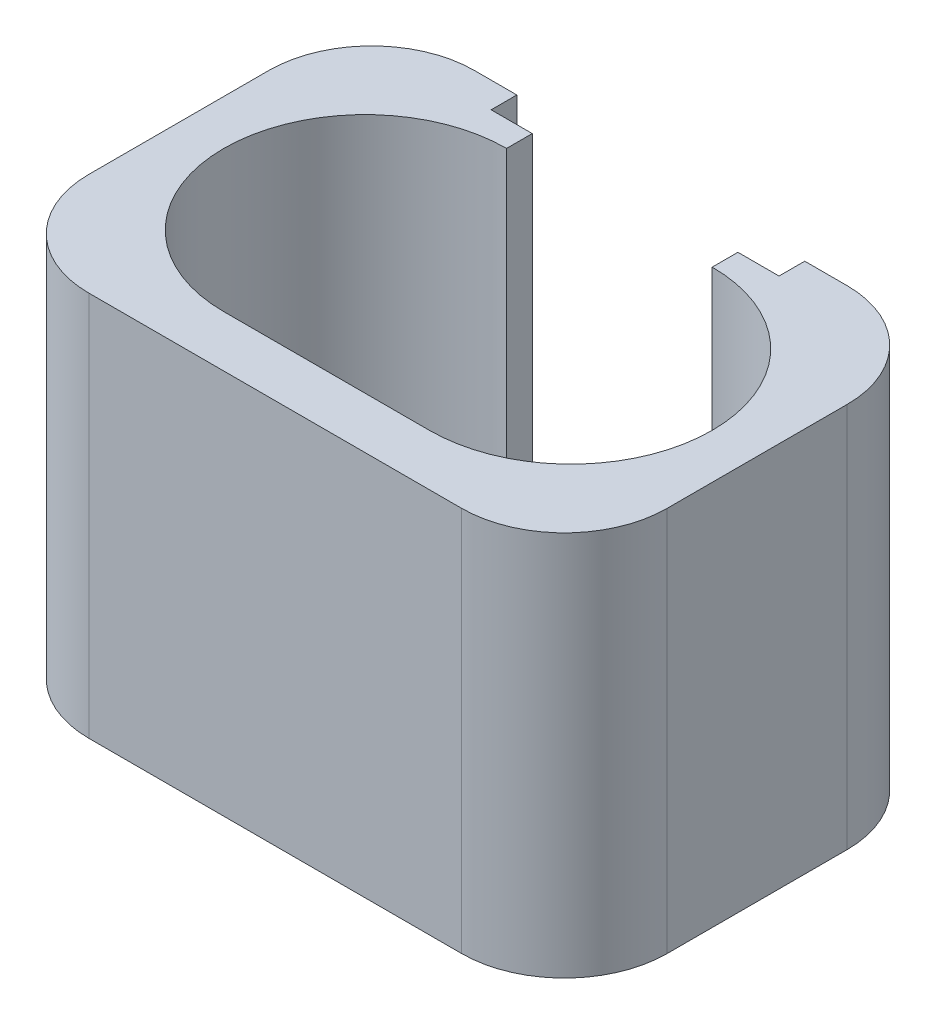
ISO-10303-21;
HEADER;
FILE_DESCRIPTION(('STEP AP214'),'2;1');
FILE_NAME('part.step','',(''),(''),'','','');
FILE_SCHEMA(('AUTOMOTIVE_DESIGN { 1 0 10303 214 1 1 1 1 }'));
ENDSEC;
DATA;
#1=APPLICATION_CONTEXT('core data for automotive mechanical design processes');
#2=APPLICATION_PROTOCOL_DEFINITION('international standard','automotive_design',2000,#1);
#3=PRODUCT_CONTEXT('',#1,'mechanical');
#4=PRODUCT('Part','Part','',(#3));
#5=PRODUCT_RELATED_PRODUCT_CATEGORY('part','',(#4));
#6=PRODUCT_DEFINITION_FORMATION('','',#4);
#7=PRODUCT_DEFINITION_CONTEXT('part definition',#1,'design');
#8=PRODUCT_DEFINITION('design','',#6,#7);
#9=PRODUCT_DEFINITION_SHAPE('','',#8);
#10=(LENGTH_UNIT() NAMED_UNIT(*) SI_UNIT(.MILLI.,.METRE.));
#11=(NAMED_UNIT(*) PLANE_ANGLE_UNIT() SI_UNIT($,.RADIAN.));
#12=(NAMED_UNIT(*) SI_UNIT($,.STERADIAN.) SOLID_ANGLE_UNIT());
#13=UNCERTAINTY_MEASURE_WITH_UNIT(LENGTH_MEASURE(1.E-05),#10,'distance_accuracy_value','');
#14=(GEOMETRIC_REPRESENTATION_CONTEXT(3) GLOBAL_UNCERTAINTY_ASSIGNED_CONTEXT((#13)) GLOBAL_UNIT_ASSIGNED_CONTEXT((#10,
#11,#12)) REPRESENTATION_CONTEXT('',''));
#15=CARTESIAN_POINT('',(0.,0.,0.));
#16=DIRECTION('',(0.,0.,1.));
#17=DIRECTION('',(1.,0.,0.));
#18=AXIS2_PLACEMENT_3D('',#15,#16,#17);
#19=CARTESIAN_POINT('',(-22.5,7.5,-15.));
#20=DIRECTION('',(0.,0.,1.));
#21=DIRECTION('',(1.,0.,0.));
#22=AXIS2_PLACEMENT_3D('',#19,#20,#21);
#23=PLANE('',#22);
#24=DIRECTION('',(-1.,0.,0.));
#25=VECTOR('',#24,1.);
#26=CARTESIAN_POINT('',(-22.5,7.5,-15.));
#27=LINE('',#26,#25);
#28=CARTESIAN_POINT('',(-4.00000000000001,7.5,-15.));
#29=VERTEX_POINT('',#28);
#30=CARTESIAN_POINT('',(-5.65000000000001,7.5,-15.));
#31=VERTEX_POINT('',#30);
#32=EDGE_CURVE('E256',#29,#31,#27,.T.);
#33=ORIENTED_EDGE('',*,*,#32,.F.);
#34=DIRECTION('',(0.,-1.,0.));
#35=VECTOR('',#34,1.);
#36=CARTESIAN_POINT('',(-4.,7.5,-15.));
#37=LINE('',#36,#35);
#38=CARTESIAN_POINT('',(-4.00000000000001,-7.5,-15.));
#39=VERTEX_POINT('',#38);
#40=EDGE_CURVE('E260',#29,#39,#37,.T.);
#41=ORIENTED_EDGE('',*,*,#40,.T.);
#42=DIRECTION('',(-1.,0.,0.));
#43=VECTOR('',#42,1.);
#44=CARTESIAN_POINT('',(-22.5,-7.5,-15.));
#45=LINE('',#44,#43);
#46=CARTESIAN_POINT('',(-5.65000000000001,-7.5,-15.));
#47=VERTEX_POINT('',#46);
#48=EDGE_CURVE('E266',#39,#47,#45,.T.);
#49=ORIENTED_EDGE('',*,*,#48,.T.);
#50=DIRECTION('',(0.,1.,0.));
#51=VECTOR('',#50,1.);
#52=CARTESIAN_POINT('',(-5.65000000000001,-7.5,-15.));
#53=LINE('',#52,#51);
#54=EDGE_CURVE('E169',#47,#31,#53,.T.);
#55=ORIENTED_EDGE('',*,*,#54,.T.);
#56=EDGE_LOOP('',(#33,#41,#49,#55));
#57=FACE_BOUND('',#56,.T.);
#58=ADVANCED_FACE('F36',(#57),#23,.F.);
#59=CARTESIAN_POINT('',(0.,7.5,0.));
#60=DIRECTION('',(0.,-1.,0.));
#61=DIRECTION('',(0.,0.,-1.));
#62=AXIS2_PLACEMENT_3D('',#59,#60,#61);
#63=PLANE('',#62);
#64=DIRECTION('',(0.,0.,-1.));
#65=VECTOR('',#64,1.);
#66=CARTESIAN_POINT('',(0.,7.5,-15.));
#67=LINE('',#66,#65);
#68=CARTESIAN_POINT('',(0.,7.5,-4.));
#69=VERTEX_POINT('',#68);
#70=CARTESIAN_POINT('',(0.,7.5,-11.));
#71=VERTEX_POINT('',#70);
#72=EDGE_CURVE('E251',#69,#71,#67,.T.);
#73=ORIENTED_EDGE('',*,*,#72,.T.);
#74=CARTESIAN_POINT('',(-4.,7.5,-11.));
#75=DIRECTION('',(0.,-1.,0.));
#76=DIRECTION('',(0.,0.,-1.));
#77=AXIS2_PLACEMENT_3D('',#74,#75,#76);
#78=CIRCLE('',#77,4.);
#79=EDGE_CURVE('E290',#71,#29,#78,.F.);
#80=ORIENTED_EDGE('',*,*,#79,.T.);
#81=ORIENTED_EDGE('',*,*,#32,.T.);
#82=DIRECTION('',(0.,0.,1.));
#83=VECTOR('',#82,1.);
#84=CARTESIAN_POINT('',(-5.65000000000001,7.5,-15.));
#85=LINE('',#84,#83);
#86=CARTESIAN_POINT('',(-5.65000000000001,7.5,-14.));
#87=VERTEX_POINT('',#86);
#88=EDGE_CURVE('E187',#31,#87,#85,.T.);
#89=ORIENTED_EDGE('',*,*,#88,.T.);
#90=DIRECTION('',(-1.,0.,0.));
#91=VECTOR('',#90,1.);
#92=CARTESIAN_POINT('',(-7.25000000000001,7.5,-14.));
#93=LINE('',#92,#91);
#94=CARTESIAN_POINT('',(-7.25000000000001,7.5,-14.));
#95=VERTEX_POINT('',#94);
#96=EDGE_CURVE('E180',#87,#95,#93,.T.);
#97=ORIENTED_EDGE('',*,*,#96,.T.);
#98=DIRECTION('',(0.,0.,-1.));
#99=VECTOR('',#98,1.);
#100=CARTESIAN_POINT('',(-7.25,7.5,0.000999999999999265));
#101=LINE('',#100,#99);
#102=CARTESIAN_POINT('',(-7.25,7.5,-13.));
#103=VERTEX_POINT('',#102);
#104=EDGE_CURVE('E212',#103,#95,#101,.T.);
#105=ORIENTED_EDGE('',*,*,#104,.F.);
#106=CARTESIAN_POINT('',(-7.25,7.5,-7.5));
#107=DIRECTION('',(0.,1.,0.));
#108=DIRECTION('',(0.,0.,1.));
#109=AXIS2_PLACEMENT_3D('',#106,#107,#108);
#110=CIRCLE('',#109,5.5);
#111=CARTESIAN_POINT('',(-7.25,7.5,-2.));
#112=VERTEX_POINT('',#111);
#113=EDGE_CURVE('E227',#112,#103,#110,.T.);
#114=ORIENTED_EDGE('',*,*,#113,.F.);
#115=DIRECTION('',(1.,0.,0.));
#116=VECTOR('',#115,1.);
#117=CARTESIAN_POINT('',(-15.25,7.5,-2.));
#118=LINE('',#117,#116);
#119=CARTESIAN_POINT('',(-15.25,7.5,-2.));
#120=VERTEX_POINT('',#119);
#121=EDGE_CURVE('E234',#120,#112,#118,.T.);
#122=ORIENTED_EDGE('',*,*,#121,.F.);
#123=CARTESIAN_POINT('',(-15.25,7.5,-7.5));
#124=DIRECTION('',(0.,1.,0.));
#125=DIRECTION('',(0.,0.,1.));
#126=AXIS2_PLACEMENT_3D('',#123,#124,#125);
#127=CIRCLE('',#126,5.5);
#128=CARTESIAN_POINT('',(-15.25,7.5,-13.));
#129=VERTEX_POINT('',#128);
#130=EDGE_CURVE('E215',#129,#120,#127,.T.);
#131=ORIENTED_EDGE('',*,*,#130,.F.);
#132=DIRECTION('',(0.,0.,-1.));
#133=VECTOR('',#132,1.);
#134=CARTESIAN_POINT('',(-15.25,7.5,0.000999999999999265));
#135=LINE('',#134,#133);
#136=CARTESIAN_POINT('',(-15.25,7.5,-14.));
#137=VERTEX_POINT('',#136);
#138=EDGE_CURVE('E216',#129,#137,#135,.T.);
#139=ORIENTED_EDGE('',*,*,#138,.T.);
#140=DIRECTION('',(1.,0.,0.));
#141=VECTOR('',#140,1.);
#142=CARTESIAN_POINT('',(-15.25,7.5,-14.));
#143=LINE('',#142,#141);
#144=CARTESIAN_POINT('',(-16.85,7.5,-14.));
#145=VERTEX_POINT('',#144);
#146=EDGE_CURVE('E199',#145,#137,#143,.T.);
#147=ORIENTED_EDGE('',*,*,#146,.F.);
#148=DIRECTION('',(0.,0.,1.));
#149=VECTOR('',#148,1.);
#150=CARTESIAN_POINT('',(-16.85,7.5,-15.));
#151=LINE('',#150,#149);
#152=CARTESIAN_POINT('',(-16.85,7.5,-15.));
#153=VERTEX_POINT('',#152);
#154=EDGE_CURVE('E192',#153,#145,#151,.T.);
#155=ORIENTED_EDGE('',*,*,#154,.F.);
#156=CARTESIAN_POINT('',(-18.5,7.5,-15.));
#157=VERTEX_POINT('',#156);
#158=EDGE_CURVE('E255',#153,#157,#27,.T.);
#159=ORIENTED_EDGE('',*,*,#158,.T.);
#160=CARTESIAN_POINT('',(-18.5,7.5,-11.));
#161=DIRECTION('',(0.,-1.,0.));
#162=DIRECTION('',(0.,0.,-1.));
#163=AXIS2_PLACEMENT_3D('',#160,#161,#162);
#164=CIRCLE('',#163,4.);
#165=CARTESIAN_POINT('',(-22.5,7.5,-11.));
#166=VERTEX_POINT('',#165);
#167=EDGE_CURVE('E285',#157,#166,#164,.F.);
#168=ORIENTED_EDGE('',*,*,#167,.T.);
#169=DIRECTION('',(0.,0.,1.));
#170=VECTOR('',#169,1.);
#171=CARTESIAN_POINT('',(-22.5,7.5,-15.));
#172=LINE('',#171,#170);
#173=CARTESIAN_POINT('',(-22.5,7.5,-4.));
#174=VERTEX_POINT('',#173);
#175=EDGE_CURVE('E258',#166,#174,#172,.T.);
#176=ORIENTED_EDGE('',*,*,#175,.T.);
#177=CARTESIAN_POINT('',(-18.5,7.5,-4.));
#178=DIRECTION('',(0.,-1.,0.));
#179=DIRECTION('',(0.,0.,-1.));
#180=AXIS2_PLACEMENT_3D('',#177,#178,#179);
#181=CIRCLE('',#180,4.);
#182=CARTESIAN_POINT('',(-18.5,7.5,0.));
#183=VERTEX_POINT('',#182);
#184=EDGE_CURVE('E58',#174,#183,#181,.F.);
#185=ORIENTED_EDGE('',*,*,#184,.T.);
#186=DIRECTION('',(1.,0.,0.));
#187=VECTOR('',#186,1.);
#188=CARTESIAN_POINT('',(-22.5,7.5,0.));
#189=LINE('',#188,#187);
#190=CARTESIAN_POINT('',(-4.00000000000001,7.5,0.));
#191=VERTEX_POINT('',#190);
#192=EDGE_CURVE('E249',#183,#191,#189,.T.);
#193=ORIENTED_EDGE('',*,*,#192,.T.);
#194=CARTESIAN_POINT('',(-4.,7.5,-4.));
#195=DIRECTION('',(0.,-1.,0.));
#196=DIRECTION('',(0.,0.,-1.));
#197=AXIS2_PLACEMENT_3D('',#194,#195,#196);
#198=CIRCLE('',#197,4.);
#199=EDGE_CURVE('E288',#191,#69,#198,.F.);
#200=ORIENTED_EDGE('',*,*,#199,.T.);
#201=EDGE_LOOP('',(#73,#80,#81,#89,#97,#105,#114,#122,#131,#139,#147,#155,#159,#168,#176,#185,
#193,#200));
#202=FACE_BOUND('',#201,.T.);
#203=ADVANCED_FACE('F305',(#202),#63,.F.);
#204=CARTESIAN_POINT('',(0.,-7.5,0.));
#205=DIRECTION('',(0.,-1.,0.));
#206=DIRECTION('',(0.,0.,-1.));
#207=AXIS2_PLACEMENT_3D('',#204,#205,#206);
#208=PLANE('',#207);
#209=ORIENTED_EDGE('',*,*,#48,.F.);
#210=CARTESIAN_POINT('',(-4.,-7.5,-11.));
#211=DIRECTION('',(0.,-1.,0.));
#212=DIRECTION('',(0.,0.,-1.));
#213=AXIS2_PLACEMENT_3D('',#210,#211,#212);
#214=CIRCLE('',#213,4.);
#215=CARTESIAN_POINT('',(0.,-7.5,-11.));
#216=VERTEX_POINT('',#215);
#217=EDGE_CURVE('E278',#39,#216,#214,.T.);
#218=ORIENTED_EDGE('',*,*,#217,.T.);
#219=DIRECTION('',(0.,0.,-1.));
#220=VECTOR('',#219,1.);
#221=CARTESIAN_POINT('',(0.,-7.5,-15.));
#222=LINE('',#221,#220);
#223=CARTESIAN_POINT('',(0.,-7.5,-4.));
#224=VERTEX_POINT('',#223);
#225=EDGE_CURVE('E262',#224,#216,#222,.T.);
#226=ORIENTED_EDGE('',*,*,#225,.F.);
#227=CARTESIAN_POINT('',(-4.,-7.5,-4.));
#228=DIRECTION('',(0.,-1.,0.));
#229=DIRECTION('',(0.,0.,-1.));
#230=AXIS2_PLACEMENT_3D('',#227,#228,#229);
#231=CIRCLE('',#230,4.);
#232=CARTESIAN_POINT('',(-4.00000000000001,-7.5,0.));
#233=VERTEX_POINT('',#232);
#234=EDGE_CURVE('E276',#224,#233,#231,.T.);
#235=ORIENTED_EDGE('',*,*,#234,.T.);
#236=DIRECTION('',(1.,0.,0.));
#237=VECTOR('',#236,1.);
#238=CARTESIAN_POINT('',(-22.5,-7.5,0.));
#239=LINE('',#238,#237);
#240=CARTESIAN_POINT('',(-18.5,-7.5,0.));
#241=VERTEX_POINT('',#240);
#242=EDGE_CURVE('E242',#241,#233,#239,.T.);
#243=ORIENTED_EDGE('',*,*,#242,.F.);
#244=CARTESIAN_POINT('',(-18.5,-7.5,-4.));
#245=DIRECTION('',(0.,-1.,0.));
#246=DIRECTION('',(0.,0.,-1.));
#247=AXIS2_PLACEMENT_3D('',#244,#245,#246);
#248=CIRCLE('',#247,4.);
#249=CARTESIAN_POINT('',(-22.5,-7.5,-4.));
#250=VERTEX_POINT('',#249);
#251=EDGE_CURVE('E274',#241,#250,#248,.T.);
#252=ORIENTED_EDGE('',*,*,#251,.T.);
#253=DIRECTION('',(0.,0.,1.));
#254=VECTOR('',#253,1.);
#255=CARTESIAN_POINT('',(-22.5,-7.5,-15.));
#256=LINE('',#255,#254);
#257=CARTESIAN_POINT('',(-22.5,-7.5,-11.));
#258=VERTEX_POINT('',#257);
#259=EDGE_CURVE('E252',#258,#250,#256,.T.);
#260=ORIENTED_EDGE('',*,*,#259,.F.);
#261=CARTESIAN_POINT('',(-18.5,-7.5,-11.));
#262=DIRECTION('',(0.,-1.,0.));
#263=DIRECTION('',(0.,0.,-1.));
#264=AXIS2_PLACEMENT_3D('',#261,#262,#263);
#265=CIRCLE('',#264,4.);
#266=CARTESIAN_POINT('',(-18.5,-7.5,-15.));
#267=VERTEX_POINT('',#266);
#268=EDGE_CURVE('E272',#258,#267,#265,.T.);
#269=ORIENTED_EDGE('',*,*,#268,.T.);
#270=CARTESIAN_POINT('',(-16.85,-7.5,-15.));
#271=VERTEX_POINT('',#270);
#272=EDGE_CURVE('E265',#271,#267,#45,.T.);
#273=ORIENTED_EDGE('',*,*,#272,.F.);
#274=DIRECTION('',(0.,0.,1.));
#275=VECTOR('',#274,1.);
#276=CARTESIAN_POINT('',(-16.85,-7.5,-15.));
#277=LINE('',#276,#275);
#278=CARTESIAN_POINT('',(-16.85,-7.5,-14.));
#279=VERTEX_POINT('',#278);
#280=EDGE_CURVE('E195',#271,#279,#277,.T.);
#281=ORIENTED_EDGE('',*,*,#280,.T.);
#282=DIRECTION('',(1.,0.,0.));
#283=VECTOR('',#282,1.);
#284=CARTESIAN_POINT('',(-15.25,-7.5,-14.));
#285=LINE('',#284,#283);
#286=CARTESIAN_POINT('',(-15.25,-7.5,-14.));
#287=VERTEX_POINT('',#286);
#288=EDGE_CURVE('E198',#279,#287,#285,.T.);
#289=ORIENTED_EDGE('',*,*,#288,.T.);
#290=DIRECTION('',(0.,0.,-1.));
#291=VECTOR('',#290,1.);
#292=CARTESIAN_POINT('',(-15.25,-7.5,0.000999999999999265));
#293=LINE('',#292,#291);
#294=CARTESIAN_POINT('',(-15.25,-7.5,-13.));
#295=VERTEX_POINT('',#294);
#296=EDGE_CURVE('E219',#295,#287,#293,.T.);
#297=ORIENTED_EDGE('',*,*,#296,.F.);
#298=CARTESIAN_POINT('',(-15.25,-7.5,-7.5));
#299=DIRECTION('',(0.,1.,0.));
#300=DIRECTION('',(0.,0.,1.));
#301=AXIS2_PLACEMENT_3D('',#298,#299,#300);
#302=CIRCLE('',#301,5.5);
#303=CARTESIAN_POINT('',(-15.25,-7.5,-2.));
#304=VERTEX_POINT('',#303);
#305=EDGE_CURVE('E223',#295,#304,#302,.T.);
#306=ORIENTED_EDGE('',*,*,#305,.T.);
#307=DIRECTION('',(1.,0.,0.));
#308=VECTOR('',#307,1.);
#309=CARTESIAN_POINT('',(-15.25,-7.5,-2.));
#310=LINE('',#309,#308);
#311=CARTESIAN_POINT('',(-7.25,-7.5,-2.));
#312=VERTEX_POINT('',#311);
#313=EDGE_CURVE('E226',#304,#312,#310,.T.);
#314=ORIENTED_EDGE('',*,*,#313,.T.);
#315=CARTESIAN_POINT('',(-7.25,-7.5,-7.5));
#316=DIRECTION('',(0.,1.,0.));
#317=DIRECTION('',(0.,0.,1.));
#318=AXIS2_PLACEMENT_3D('',#315,#316,#317);
#319=CIRCLE('',#318,5.5);
#320=CARTESIAN_POINT('',(-7.25,-7.5,-13.));
#321=VERTEX_POINT('',#320);
#322=EDGE_CURVE('E230',#312,#321,#319,.T.);
#323=ORIENTED_EDGE('',*,*,#322,.T.);
#324=DIRECTION('',(0.,0.,-1.));
#325=VECTOR('',#324,1.);
#326=CARTESIAN_POINT('',(-7.25,-7.5,0.000999999999999265));
#327=LINE('',#326,#325);
#328=CARTESIAN_POINT('',(-7.25,-7.5,-14.));
#329=VERTEX_POINT('',#328);
#330=EDGE_CURVE('E186',#321,#329,#327,.T.);
#331=ORIENTED_EDGE('',*,*,#330,.T.);
#332=DIRECTION('',(-1.,0.,0.));
#333=VECTOR('',#332,1.);
#334=CARTESIAN_POINT('',(-7.25000000000001,-7.5,-14.));
#335=LINE('',#334,#333);
#336=CARTESIAN_POINT('',(-5.65000000000001,-7.5,-14.));
#337=VERTEX_POINT('',#336);
#338=EDGE_CURVE('E174',#337,#329,#335,.T.);
#339=ORIENTED_EDGE('',*,*,#338,.F.);
#340=DIRECTION('',(0.,0.,1.));
#341=VECTOR('',#340,1.);
#342=CARTESIAN_POINT('',(-5.65000000000001,-7.5,-15.));
#343=LINE('',#342,#341);
#344=EDGE_CURVE('E162',#47,#337,#343,.T.);
#345=ORIENTED_EDGE('',*,*,#344,.F.);
#346=EDGE_LOOP('',(#209,#218,#226,#235,#243,#252,#260,#269,#273,#281,#289,#297,#306,#314,#323,
#331,#339,#345));
#347=FACE_BOUND('',#346,.T.);
#348=ADVANCED_FACE('F184',(#347),#208,.T.);
#349=CARTESIAN_POINT('',(-7.25,7.5,0.000999999999999265));
#350=DIRECTION('',(1.,0.,0.));
#351=DIRECTION('',(0.,1.,0.));
#352=AXIS2_PLACEMENT_3D('',#349,#350,#351);
#353=PLANE('',#352);
#354=DIRECTION('',(0.,1.,0.));
#355=VECTOR('',#354,1.);
#356=CARTESIAN_POINT('',(-7.25000000000001,-7.5,-14.));
#357=LINE('',#356,#355);
#358=EDGE_CURVE('E173',#329,#95,#357,.T.);
#359=ORIENTED_EDGE('',*,*,#358,.F.);
#360=ORIENTED_EDGE('',*,*,#330,.F.);
#361=DIRECTION('',(0.,1.,0.));
#362=VECTOR('',#361,1.);
#363=CARTESIAN_POINT('',(-7.25,-7.5,-13.));
#364=LINE('',#363,#362);
#365=EDGE_CURVE('E243',#321,#103,#364,.T.);
#366=ORIENTED_EDGE('',*,*,#365,.T.);
#367=ORIENTED_EDGE('',*,*,#104,.T.);
#368=EDGE_LOOP('',(#359,#360,#366,#367));
#369=FACE_BOUND('',#368,.T.);
#370=ADVANCED_FACE('F330',(#369),#353,.F.);
#371=CARTESIAN_POINT('',(-22.5,7.5,0.));
#372=DIRECTION('',(0.,0.,-1.));
#373=DIRECTION('',(-1.,0.,0.));
#374=AXIS2_PLACEMENT_3D('',#371,#372,#373);
#375=PLANE('',#374);
#376=ORIENTED_EDGE('',*,*,#242,.T.);
#377=DIRECTION('',(0.,-1.,0.));
#378=VECTOR('',#377,1.);
#379=CARTESIAN_POINT('',(-4.,7.5,0.));
#380=LINE('',#379,#378);
#381=EDGE_CURVE('E51',#233,#191,#380,.F.);
#382=ORIENTED_EDGE('',*,*,#381,.T.);
#383=ORIENTED_EDGE('',*,*,#192,.F.);
#384=DIRECTION('',(0.,-1.,0.));
#385=VECTOR('',#384,1.);
#386=CARTESIAN_POINT('',(-18.5,7.5,0.));
#387=LINE('',#386,#385);
#388=EDGE_CURVE('E292',#183,#241,#387,.T.);
#389=ORIENTED_EDGE('',*,*,#388,.T.);
#390=EDGE_LOOP('',(#376,#382,#383,#389));
#391=FACE_BOUND('',#390,.T.);
#392=ADVANCED_FACE('F311',(#391),#375,.F.);
#393=CARTESIAN_POINT('',(0.,7.5,-15.));
#394=DIRECTION('',(-1.,0.,0.));
#395=DIRECTION('',(0.,0.,1.));
#396=AXIS2_PLACEMENT_3D('',#393,#394,#395);
#397=PLANE('',#396);
#398=ORIENTED_EDGE('',*,*,#225,.T.);
#399=DIRECTION('',(0.,-1.,0.));
#400=VECTOR('',#399,1.);
#401=CARTESIAN_POINT('',(0.,7.5,-11.));
#402=LINE('',#401,#400);
#403=EDGE_CURVE('E283',#216,#71,#402,.F.);
#404=ORIENTED_EDGE('',*,*,#403,.T.);
#405=ORIENTED_EDGE('',*,*,#72,.F.);
#406=DIRECTION('',(0.,-1.,0.));
#407=VECTOR('',#406,1.);
#408=CARTESIAN_POINT('',(0.,7.5,-4.));
#409=LINE('',#408,#407);
#410=EDGE_CURVE('E280',#69,#224,#409,.T.);
#411=ORIENTED_EDGE('',*,*,#410,.T.);
#412=EDGE_LOOP('',(#398,#404,#405,#411));
#413=FACE_BOUND('',#412,.T.);
#414=ADVANCED_FACE('F319',(#413),#397,.F.);
#415=ORIENTED_EDGE('',*,*,#272,.T.);
#416=DIRECTION('',(0.,-1.,0.));
#417=VECTOR('',#416,1.);
#418=CARTESIAN_POINT('',(-18.5,7.5,-15.));
#419=LINE('',#418,#417);
#420=EDGE_CURVE('E11',#267,#157,#419,.F.);
#421=ORIENTED_EDGE('',*,*,#420,.T.);
#422=ORIENTED_EDGE('',*,*,#158,.F.);
#423=DIRECTION('',(0.,1.,0.));
#424=VECTOR('',#423,1.);
#425=CARTESIAN_POINT('',(-16.85,-7.5,-15.));
#426=LINE('',#425,#424);
#427=EDGE_CURVE('E202',#271,#153,#426,.T.);
#428=ORIENTED_EDGE('',*,*,#427,.F.);
#429=EDGE_LOOP('',(#415,#421,#422,#428));
#430=FACE_BOUND('',#429,.T.);
#431=ADVANCED_FACE('F357',(#430),#23,.F.);
#432=CARTESIAN_POINT('',(-22.5,7.5,-15.));
#433=DIRECTION('',(1.,0.,0.));
#434=DIRECTION('',(0.,0.,-1.));
#435=AXIS2_PLACEMENT_3D('',#432,#433,#434);
#436=PLANE('',#435);
#437=ORIENTED_EDGE('',*,*,#259,.T.);
#438=DIRECTION('',(0.,-1.,0.));
#439=VECTOR('',#438,1.);
#440=CARTESIAN_POINT('',(-22.5,7.5,-4.));
#441=LINE('',#440,#439);
#442=EDGE_CURVE('E44',#250,#174,#441,.F.);
#443=ORIENTED_EDGE('',*,*,#442,.T.);
#444=ORIENTED_EDGE('',*,*,#175,.F.);
#445=DIRECTION('',(0.,-1.,0.));
#446=VECTOR('',#445,1.);
#447=CARTESIAN_POINT('',(-22.5,7.5,-11.));
#448=LINE('',#447,#446);
#449=EDGE_CURVE('E296',#166,#258,#448,.T.);
#450=ORIENTED_EDGE('',*,*,#449,.T.);
#451=EDGE_LOOP('',(#437,#443,#444,#450));
#452=FACE_BOUND('',#451,.T.);
#453=ADVANCED_FACE('F301',(#452),#436,.F.);
#454=CARTESIAN_POINT('',(-15.25,-7.5,-7.5));
#455=DIRECTION('',(0.,1.,0.));
#456=DIRECTION('',(0.,0.,1.));
#457=AXIS2_PLACEMENT_3D('',#454,#455,#456);
#458=CYLINDRICAL_SURFACE('',#457,5.5);
#459=ORIENTED_EDGE('',*,*,#130,.T.);
#460=DIRECTION('',(0.,1.,0.));
#461=VECTOR('',#460,1.);
#462=CARTESIAN_POINT('',(-15.25,-7.5,-2.));
#463=LINE('',#462,#461);
#464=EDGE_CURVE('E232',#304,#120,#463,.T.);
#465=ORIENTED_EDGE('',*,*,#464,.F.);
#466=ORIENTED_EDGE('',*,*,#305,.F.);
#467=DIRECTION('',(0.,1.,0.));
#468=VECTOR('',#467,1.);
#469=CARTESIAN_POINT('',(-15.25,-7.5,-13.));
#470=LINE('',#469,#468);
#471=EDGE_CURVE('E239',#295,#129,#470,.T.);
#472=ORIENTED_EDGE('',*,*,#471,.T.);
#473=EDGE_LOOP('',(#459,#465,#466,#472));
#474=FACE_BOUND('',#473,.T.);
#475=ADVANCED_FACE('F344',(#474),#458,.F.);
#476=CARTESIAN_POINT('',(-7.25,-7.5,-7.5));
#477=DIRECTION('',(0.,1.,0.));
#478=DIRECTION('',(0.,0.,1.));
#479=AXIS2_PLACEMENT_3D('',#476,#477,#478);
#480=CYLINDRICAL_SURFACE('',#479,5.5);
#481=ORIENTED_EDGE('',*,*,#113,.T.);
#482=ORIENTED_EDGE('',*,*,#365,.F.);
#483=ORIENTED_EDGE('',*,*,#322,.F.);
#484=DIRECTION('',(0.,1.,0.));
#485=VECTOR('',#484,1.);
#486=CARTESIAN_POINT('',(-7.25,-7.5,-2.));
#487=LINE('',#486,#485);
#488=EDGE_CURVE('E245',#312,#112,#487,.T.);
#489=ORIENTED_EDGE('',*,*,#488,.T.);
#490=EDGE_LOOP('',(#481,#482,#483,#489));
#491=FACE_BOUND('',#490,.T.);
#492=ADVANCED_FACE('F333',(#491),#480,.F.);
#493=CARTESIAN_POINT('',(-15.25,-7.5,-2.));
#494=DIRECTION('',(0.,0.,1.));
#495=DIRECTION('',(1.,0.,0.));
#496=AXIS2_PLACEMENT_3D('',#493,#494,#495);
#497=PLANE('',#496);
#498=ORIENTED_EDGE('',*,*,#121,.T.);
#499=ORIENTED_EDGE('',*,*,#488,.F.);
#500=ORIENTED_EDGE('',*,*,#313,.F.);
#501=ORIENTED_EDGE('',*,*,#464,.T.);
#502=EDGE_LOOP('',(#498,#499,#500,#501));
#503=FACE_BOUND('',#502,.T.);
#504=ADVANCED_FACE('F339',(#503),#497,.F.);
#505=CARTESIAN_POINT('',(-15.25,7.5,0.000999999999999265));
#506=DIRECTION('',(-1.,0.,0.));
#507=DIRECTION('',(0.,-1.,0.));
#508=AXIS2_PLACEMENT_3D('',#505,#506,#507);
#509=PLANE('',#508);
#510=ORIENTED_EDGE('',*,*,#296,.T.);
#511=DIRECTION('',(0.,1.,0.));
#512=VECTOR('',#511,1.);
#513=CARTESIAN_POINT('',(-15.25,-7.5,-14.));
#514=LINE('',#513,#512);
#515=EDGE_CURVE('E206',#287,#137,#514,.T.);
#516=ORIENTED_EDGE('',*,*,#515,.T.);
#517=ORIENTED_EDGE('',*,*,#138,.F.);
#518=ORIENTED_EDGE('',*,*,#471,.F.);
#519=EDGE_LOOP('',(#510,#516,#517,#518));
#520=FACE_BOUND('',#519,.T.);
#521=ADVANCED_FACE('F346',(#520),#509,.F.);
#522=CARTESIAN_POINT('',(-15.25,-7.5,-14.));
#523=DIRECTION('',(0.,0.,1.));
#524=DIRECTION('',(1.,0.,0.));
#525=AXIS2_PLACEMENT_3D('',#522,#523,#524);
#526=PLANE('',#525);
#527=ORIENTED_EDGE('',*,*,#146,.T.);
#528=ORIENTED_EDGE('',*,*,#515,.F.);
#529=ORIENTED_EDGE('',*,*,#288,.F.);
#530=DIRECTION('',(0.,1.,0.));
#531=VECTOR('',#530,1.);
#532=CARTESIAN_POINT('',(-16.85,-7.5,-14.));
#533=LINE('',#532,#531);
#534=EDGE_CURVE('E209',#279,#145,#533,.T.);
#535=ORIENTED_EDGE('',*,*,#534,.T.);
#536=EDGE_LOOP('',(#527,#528,#529,#535));
#537=FACE_BOUND('',#536,.T.);
#538=ADVANCED_FACE('F350',(#537),#526,.F.);
#539=CARTESIAN_POINT('',(-16.85,-7.5,-15.));
#540=DIRECTION('',(-1.,0.,0.));
#541=DIRECTION('',(0.,0.,1.));
#542=AXIS2_PLACEMENT_3D('',#539,#540,#541);
#543=PLANE('',#542);
#544=ORIENTED_EDGE('',*,*,#154,.T.);
#545=ORIENTED_EDGE('',*,*,#534,.F.);
#546=ORIENTED_EDGE('',*,*,#280,.F.);
#547=ORIENTED_EDGE('',*,*,#427,.T.);
#548=EDGE_LOOP('',(#544,#545,#546,#547));
#549=FACE_BOUND('',#548,.T.);
#550=ADVANCED_FACE('F471',(#549),#543,.F.);
#551=CARTESIAN_POINT('',(-5.65000000000001,-7.5,-15.));
#552=DIRECTION('',(-1.,0.,0.));
#553=DIRECTION('',(0.,0.,1.));
#554=AXIS2_PLACEMENT_3D('',#551,#552,#553);
#555=PLANE('',#554);
#556=ORIENTED_EDGE('',*,*,#88,.F.);
#557=ORIENTED_EDGE('',*,*,#54,.F.);
#558=ORIENTED_EDGE('',*,*,#344,.T.);
#559=DIRECTION('',(0.,1.,0.));
#560=VECTOR('',#559,1.);
#561=CARTESIAN_POINT('',(-5.65000000000001,-7.5,-14.));
#562=LINE('',#561,#560);
#563=EDGE_CURVE('E166',#337,#87,#562,.T.);
#564=ORIENTED_EDGE('',*,*,#563,.T.);
#565=EDGE_LOOP('',(#556,#557,#558,#564));
#566=FACE_BOUND('',#565,.T.);
#567=ADVANCED_FACE('F165',(#566),#555,.T.);
#568=CARTESIAN_POINT('',(-7.25000000000001,-7.5,-14.));
#569=DIRECTION('',(0.,0.,-1.));
#570=DIRECTION('',(-1.,0.,0.));
#571=AXIS2_PLACEMENT_3D('',#568,#569,#570);
#572=PLANE('',#571);
#573=ORIENTED_EDGE('',*,*,#96,.F.);
#574=ORIENTED_EDGE('',*,*,#563,.F.);
#575=ORIENTED_EDGE('',*,*,#338,.T.);
#576=ORIENTED_EDGE('',*,*,#358,.T.);
#577=EDGE_LOOP('',(#573,#574,#575,#576));
#578=FACE_BOUND('',#577,.T.);
#579=ADVANCED_FACE('F177',(#578),#572,.T.);
#580=CARTESIAN_POINT('',(-4.,7.5,-11.));
#581=DIRECTION('',(0.,-1.,0.));
#582=DIRECTION('',(0.,0.,-1.));
#583=AXIS2_PLACEMENT_3D('',#580,#581,#582);
#584=CYLINDRICAL_SURFACE('',#583,4.);
#585=ORIENTED_EDGE('',*,*,#79,.F.);
#586=ORIENTED_EDGE('',*,*,#403,.F.);
#587=ORIENTED_EDGE('',*,*,#217,.F.);
#588=ORIENTED_EDGE('',*,*,#40,.F.);
#589=EDGE_LOOP('',(#585,#586,#587,#588));
#590=FACE_BOUND('',#589,.T.);
#591=ADVANCED_FACE('F325',(#590),#584,.T.);
#592=CARTESIAN_POINT('',(-4.,7.5,-4.));
#593=DIRECTION('',(0.,-1.,0.));
#594=DIRECTION('',(0.,0.,-1.));
#595=AXIS2_PLACEMENT_3D('',#592,#593,#594);
#596=CYLINDRICAL_SURFACE('',#595,4.);
#597=ORIENTED_EDGE('',*,*,#199,.F.);
#598=ORIENTED_EDGE('',*,*,#381,.F.);
#599=ORIENTED_EDGE('',*,*,#234,.F.);
#600=ORIENTED_EDGE('',*,*,#410,.F.);
#601=EDGE_LOOP('',(#597,#598,#599,#600));
#602=FACE_BOUND('',#601,.T.);
#603=ADVANCED_FACE('F316',(#602),#596,.T.);
#604=CARTESIAN_POINT('',(-18.5,7.5,-4.));
#605=DIRECTION('',(0.,-1.,0.));
#606=DIRECTION('',(0.,0.,-1.));
#607=AXIS2_PLACEMENT_3D('',#604,#605,#606);
#608=CYLINDRICAL_SURFACE('',#607,4.);
#609=ORIENTED_EDGE('',*,*,#184,.F.);
#610=ORIENTED_EDGE('',*,*,#442,.F.);
#611=ORIENTED_EDGE('',*,*,#251,.F.);
#612=ORIENTED_EDGE('',*,*,#388,.F.);
#613=EDGE_LOOP('',(#609,#610,#611,#612));
#614=FACE_BOUND('',#613,.T.);
#615=ADVANCED_FACE('F309',(#614),#608,.T.);
#616=CARTESIAN_POINT('',(-18.5,7.5,-11.));
#617=DIRECTION('',(0.,-1.,0.));
#618=DIRECTION('',(0.,0.,-1.));
#619=AXIS2_PLACEMENT_3D('',#616,#617,#618);
#620=CYLINDRICAL_SURFACE('',#619,4.);
#621=ORIENTED_EDGE('',*,*,#167,.F.);
#622=ORIENTED_EDGE('',*,*,#420,.F.);
#623=ORIENTED_EDGE('',*,*,#268,.F.);
#624=ORIENTED_EDGE('',*,*,#449,.F.);
#625=EDGE_LOOP('',(#621,#622,#623,#624));
#626=FACE_BOUND('',#625,.T.);
#627=ADVANCED_FACE('F38',(#626),#620,.T.);
#628=CLOSED_SHELL('',(#58,#203,#348,#370,#392,#414,#431,#453,#475,#492,#504,#521,#538,#550,#567,
#579,#591,#603,#615,#627));
#629=MANIFOLD_SOLID_BREP('B2',#628);
#630=ADVANCED_BREP_SHAPE_REPRESENTATION('',(#18,#629),#14);
#631=SHAPE_DEFINITION_REPRESENTATION(#9,#630);
ENDSEC;
END-ISO-10303-21;
